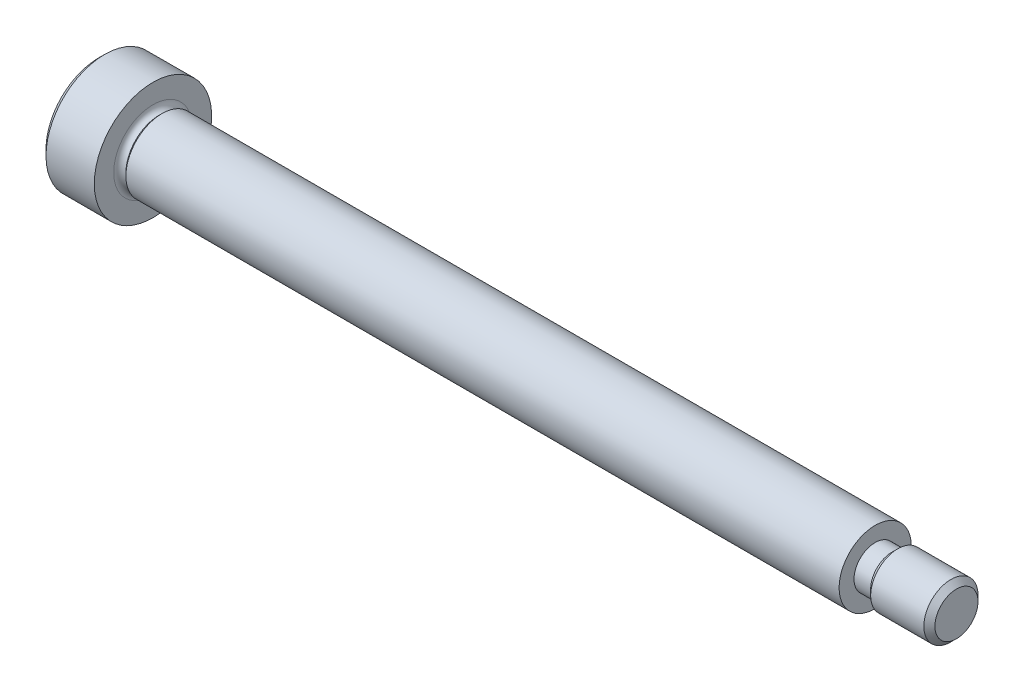
ISO-10303-21;
HEADER;
FILE_DESCRIPTION(('STEP AP214'),'2;1');
FILE_NAME('part.step','',(''),(''),'','','');
FILE_SCHEMA(('AUTOMOTIVE_DESIGN { 1 0 10303 214 1 1 1 1 }'));
ENDSEC;
DATA;
#1=APPLICATION_CONTEXT('core data for automotive mechanical design processes');
#2=APPLICATION_PROTOCOL_DEFINITION('international standard','automotive_design',2000,#1);
#3=PRODUCT_CONTEXT('',#1,'mechanical');
#4=PRODUCT('Part','Part','',(#3));
#5=PRODUCT_RELATED_PRODUCT_CATEGORY('part','',(#4));
#6=PRODUCT_DEFINITION_FORMATION('','',#4);
#7=PRODUCT_DEFINITION_CONTEXT('part definition',#1,'design');
#8=PRODUCT_DEFINITION('design','',#6,#7);
#9=PRODUCT_DEFINITION_SHAPE('','',#8);
#10=(LENGTH_UNIT() NAMED_UNIT(*) SI_UNIT(.MILLI.,.METRE.));
#11=(NAMED_UNIT(*) PLANE_ANGLE_UNIT() SI_UNIT($,.RADIAN.));
#12=(NAMED_UNIT(*) SI_UNIT($,.STERADIAN.) SOLID_ANGLE_UNIT());
#13=UNCERTAINTY_MEASURE_WITH_UNIT(LENGTH_MEASURE(1.E-05),#10,'distance_accuracy_value','');
#14=(GEOMETRIC_REPRESENTATION_CONTEXT(3) GLOBAL_UNCERTAINTY_ASSIGNED_CONTEXT((#13)) GLOBAL_UNIT_ASSIGNED_CONTEXT((#10,
#11,#12)) REPRESENTATION_CONTEXT('',''));
#15=CARTESIAN_POINT('',(0.,0.,0.));
#16=DIRECTION('',(0.,0.,1.));
#17=DIRECTION('',(1.,0.,0.));
#18=AXIS2_PLACEMENT_3D('',#15,#16,#17);
#19=CARTESIAN_POINT('',(-6.,-6.00984515230403,5.85));
#20=DIRECTION('',(-1.,0.,0.));
#21=DIRECTION('',(0.,1.,0.));
#22=AXIS2_PLACEMENT_3D('',#19,#20,#21);
#23=PLANE('',#22);
#24=CARTESIAN_POINT('',(-6.,0.,0.));
#25=DIRECTION('',(-1.,0.,0.));
#26=DIRECTION('',(0.,0.,-1.));
#27=AXIS2_PLACEMENT_3D('',#24,#25,#26);
#28=CIRCLE('',#27,5.85);
#29=CARTESIAN_POINT('',(-6.,0.,-5.85));
#30=VERTEX_POINT('',#29);
#31=EDGE_CURVE('E111',#30,#30,#28,.F.);
#32=ORIENTED_EDGE('',*,*,#31,.F.);
#33=EDGE_LOOP('',(#32));
#34=FACE_BOUND('',#33,.T.);
#35=DIRECTION('',(0.,0.499999999999983,-0.866025403784448));
#36=VECTOR('',#35,1.);
#37=CARTESIAN_POINT('',(-6.,-2.8867513459481,0.));
#38=LINE('',#37,#36);
#39=CARTESIAN_POINT('',(-6.,-1.4433756729741,-2.5));
#40=VERTEX_POINT('',#39);
#41=CARTESIAN_POINT('',(-6.,-2.8867513459481,0.));
#42=VERTEX_POINT('',#41);
#43=EDGE_CURVE('E98',#40,#42,#38,.F.);
#44=ORIENTED_EDGE('',*,*,#43,.F.);
#45=DIRECTION('',(0.,1.,0.));
#46=VECTOR('',#45,1.);
#47=CARTESIAN_POINT('',(-6.,-1.4433756729741,-2.5));
#48=LINE('',#47,#46);
#49=CARTESIAN_POINT('',(-6.,1.4433756729741,-2.5));
#50=VERTEX_POINT('',#49);
#51=EDGE_CURVE('E87',#50,#40,#48,.F.);
#52=ORIENTED_EDGE('',*,*,#51,.F.);
#53=DIRECTION('',(0.,0.499999999999983,0.866025403784449));
#54=VECTOR('',#53,1.);
#55=CARTESIAN_POINT('',(-6.,1.4433756729741,-2.5));
#56=LINE('',#55,#54);
#57=CARTESIAN_POINT('',(-6.,2.8867513459481,0.));
#58=VERTEX_POINT('',#57);
#59=EDGE_CURVE('E97',#58,#50,#56,.F.);
#60=ORIENTED_EDGE('',*,*,#59,.F.);
#61=DIRECTION('',(0.,-0.499999999999982,0.866025403784449));
#62=VECTOR('',#61,1.);
#63=CARTESIAN_POINT('',(-6.,2.8867513459481,0.));
#64=LINE('',#63,#62);
#65=CARTESIAN_POINT('',(-6.,1.4433756729741,2.5));
#66=VERTEX_POINT('',#65);
#67=EDGE_CURVE('E121',#66,#58,#64,.F.);
#68=ORIENTED_EDGE('',*,*,#67,.F.);
#69=DIRECTION('',(0.,-1.,0.));
#70=VECTOR('',#69,1.);
#71=CARTESIAN_POINT('',(-6.,1.4433756729741,2.5));
#72=LINE('',#71,#70);
#73=CARTESIAN_POINT('',(-6.,-1.4433756729741,2.5));
#74=VERTEX_POINT('',#73);
#75=EDGE_CURVE('E125',#74,#66,#72,.F.);
#76=ORIENTED_EDGE('',*,*,#75,.F.);
#77=DIRECTION('',(0.,-0.499999999999983,-0.866025403784448));
#78=VECTOR('',#77,1.);
#79=CARTESIAN_POINT('',(-6.,-1.4433756729741,2.5));
#80=LINE('',#79,#78);
#81=EDGE_CURVE('E110',#42,#74,#80,.F.);
#82=ORIENTED_EDGE('',*,*,#81,.F.);
#83=EDGE_LOOP('',(#44,#52,#60,#68,#76,#82));
#84=FACE_BOUND('',#83,.T.);
#85=ADVANCED_FACE('F17',(#34,#84),#23,.T.);
#86=CARTESIAN_POINT('',(0.,-6.67760572478225,-6.5));
#87=DIRECTION('',(1.,0.,0.));
#88=DIRECTION('',(0.,1.,0.));
#89=AXIS2_PLACEMENT_3D('',#86,#87,#88);
#90=PLANE('',#89);
#91=CARTESIAN_POINT('',(0.,0.,0.));
#92=DIRECTION('',(1.,0.,0.));
#93=DIRECTION('',(0.,0.,1.));
#94=AXIS2_PLACEMENT_3D('',#91,#92,#93);
#95=CIRCLE('',#94,6.5);
#96=CARTESIAN_POINT('',(0.,0.,6.5));
#97=VERTEX_POINT('',#96);
#98=EDGE_CURVE('E133',#97,#97,#95,.T.);
#99=ORIENTED_EDGE('',*,*,#98,.T.);
#100=EDGE_LOOP('',(#99));
#101=FACE_BOUND('',#100,.T.);
#102=CARTESIAN_POINT('',(0.,0.,0.));
#103=DIRECTION('',(-1.,0.,0.));
#104=DIRECTION('',(0.,0.,-1.));
#105=AXIS2_PLACEMENT_3D('',#102,#103,#104);
#106=CIRCLE('',#105,4.35000000000001);
#107=CARTESIAN_POINT('',(0.,0.,-4.35000000000001));
#108=VERTEX_POINT('',#107);
#109=EDGE_CURVE('E138',#108,#108,#106,.F.);
#110=ORIENTED_EDGE('',*,*,#109,.F.);
#111=EDGE_LOOP('',(#110));
#112=FACE_BOUND('',#111,.T.);
#113=ADVANCED_FACE('F284',(#101,#112),#90,.T.);
#114=CARTESIAN_POINT('',(80.,-4.,-4.));
#115=DIRECTION('',(1.,0.,0.));
#116=DIRECTION('',(0.,1.,0.));
#117=AXIS2_PLACEMENT_3D('',#114,#115,#116);
#118=PLANE('',#117);
#119=CARTESIAN_POINT('',(80.,0.,0.));
#120=DIRECTION('',(1.,0.,0.));
#121=DIRECTION('',(0.,0.,1.));
#122=AXIS2_PLACEMENT_3D('',#119,#120,#121);
#123=CIRCLE('',#122,4.);
#124=CARTESIAN_POINT('',(80.,0.,4.));
#125=VERTEX_POINT('',#124);
#126=EDGE_CURVE('E141',#125,#125,#123,.T.);
#127=ORIENTED_EDGE('',*,*,#126,.T.);
#128=EDGE_LOOP('',(#127));
#129=FACE_BOUND('',#128,.T.);
#130=CARTESIAN_POINT('',(80.,0.,0.));
#131=DIRECTION('',(-1.,0.,0.));
#132=DIRECTION('',(0.,0.,-1.));
#133=AXIS2_PLACEMENT_3D('',#130,#131,#132);
#134=CIRCLE('',#133,2.35);
#135=CARTESIAN_POINT('',(80.,0.,-2.35));
#136=VERTEX_POINT('',#135);
#137=EDGE_CURVE('E144',#136,#136,#134,.F.);
#138=ORIENTED_EDGE('',*,*,#137,.F.);
#139=EDGE_LOOP('',(#138));
#140=FACE_BOUND('',#139,.T.);
#141=ADVANCED_FACE('F281',(#129,#140),#118,.T.);
#142=CARTESIAN_POINT('',(89.,-2.3865,-2.3865));
#143=DIRECTION('',(1.,0.,0.));
#144=DIRECTION('',(0.,1.,0.));
#145=AXIS2_PLACEMENT_3D('',#142,#143,#144);
#146=PLANE('',#145);
#147=CARTESIAN_POINT('',(89.,0.,0.));
#148=DIRECTION('',(1.,0.,0.));
#149=DIRECTION('',(0.,0.,1.));
#150=AXIS2_PLACEMENT_3D('',#147,#148,#149);
#151=CIRCLE('',#150,2.3865);
#152=CARTESIAN_POINT('',(89.,0.,2.3865));
#153=VERTEX_POINT('',#152);
#154=EDGE_CURVE('E147',#153,#153,#151,.T.);
#155=ORIENTED_EDGE('',*,*,#154,.T.);
#156=EDGE_LOOP('',(#155));
#157=FACE_BOUND('',#156,.T.);
#158=ADVANCED_FACE('F283',(#157),#146,.T.);
#159=CARTESIAN_POINT('',(-3.,-2.16506350946112,-1.24999999999996));
#160=DIRECTION('',(-1.,0.,0.));
#161=DIRECTION('',(0.,1.,0.));
#162=AXIS2_PLACEMENT_3D('',#159,#160,#161);
#163=PLANE('',#162);
#164=DIRECTION('',(0.,-1.,0.));
#165=VECTOR('',#164,1.);
#166=CARTESIAN_POINT('',(-3.,0.,-2.5));
#167=LINE('',#166,#165);
#168=CARTESIAN_POINT('',(-3.,-1.4433756729741,-2.5));
#169=VERTEX_POINT('',#168);
#170=CARTESIAN_POINT('',(-3.,0.,-2.5));
#171=VERTEX_POINT('',#170);
#172=EDGE_CURVE('E150',#169,#171,#167,.F.);
#173=ORIENTED_EDGE('',*,*,#172,.F.);
#174=DIRECTION('',(0.,-0.499999999999983,0.866025403784448));
#175=VECTOR('',#174,1.);
#176=CARTESIAN_POINT('',(-3.,-1.4433756729741,-2.5));
#177=LINE('',#176,#175);
#178=CARTESIAN_POINT('',(-3.,-2.16506350946112,-1.24999999999996));
#179=VERTEX_POINT('',#178);
#180=EDGE_CURVE('E105',#179,#169,#177,.F.);
#181=ORIENTED_EDGE('',*,*,#180,.F.);
#182=CARTESIAN_POINT('',(-3.,0.,0.));
#183=DIRECTION('',(1.,0.,0.));
#184=DIRECTION('',(0.,-0.866025403784448,-0.499999999999983));
#185=AXIS2_PLACEMENT_3D('',#182,#183,#184);
#186=CIRCLE('',#185,2.5);
#187=EDGE_CURVE('E155',#179,#171,#186,.T.);
#188=ORIENTED_EDGE('',*,*,#187,.T.);
#189=EDGE_LOOP('',(#173,#181,#188));
#190=FACE_BOUND('',#189,.T.);
#191=ADVANCED_FACE('F292',(#190),#163,.T.);
#192=CARTESIAN_POINT('',(-3.,-2.8867513459481,1.24999999999996));
#193=DIRECTION('',(-1.,0.,0.));
#194=DIRECTION('',(0.,1.,0.));
#195=AXIS2_PLACEMENT_3D('',#192,#193,#194);
#196=PLANE('',#195);
#197=DIRECTION('',(0.,-0.499999999999983,0.866025403784448));
#198=VECTOR('',#197,1.);
#199=CARTESIAN_POINT('',(-3.,-2.16506350946112,-1.24999999999996));
#200=LINE('',#199,#198);
#201=CARTESIAN_POINT('',(-3.,-2.8867513459481,0.));
#202=VERTEX_POINT('',#201);
#203=EDGE_CURVE('E160',#202,#179,#200,.F.);
#204=ORIENTED_EDGE('',*,*,#203,.F.);
#205=DIRECTION('',(0.,0.499999999999983,0.866025403784448));
#206=VECTOR('',#205,1.);
#207=CARTESIAN_POINT('',(-3.,-2.8867513459481,0.));
#208=LINE('',#207,#206);
#209=CARTESIAN_POINT('',(-3.,-2.16506350946112,1.24999999999996));
#210=VERTEX_POINT('',#209);
#211=EDGE_CURVE('E164',#210,#202,#208,.F.);
#212=ORIENTED_EDGE('',*,*,#211,.F.);
#213=CARTESIAN_POINT('',(-3.,0.,0.));
#214=DIRECTION('',(1.,0.,0.));
#215=DIRECTION('',(0.,-0.866025403784448,0.499999999999983));
#216=AXIS2_PLACEMENT_3D('',#213,#214,#215);
#217=CIRCLE('',#216,2.5);
#218=EDGE_CURVE('E169',#210,#179,#217,.T.);
#219=ORIENTED_EDGE('',*,*,#218,.T.);
#220=EDGE_LOOP('',(#204,#212,#219));
#221=FACE_BOUND('',#220,.T.);
#222=ADVANCED_FACE('F355',(#221),#196,.T.);
#223=CARTESIAN_POINT('',(-3.,-2.16506350946112,2.5));
#224=DIRECTION('',(-1.,0.,0.));
#225=DIRECTION('',(0.,1.,0.));
#226=AXIS2_PLACEMENT_3D('',#223,#224,#225);
#227=PLANE('',#226);
#228=DIRECTION('',(0.,0.499999999999983,0.866025403784448));
#229=VECTOR('',#228,1.);
#230=CARTESIAN_POINT('',(-3.,-2.16506350946112,1.24999999999996));
#231=LINE('',#230,#229);
#232=CARTESIAN_POINT('',(-3.,-1.4433756729741,2.5));
#233=VERTEX_POINT('',#232);
#234=EDGE_CURVE('E174',#233,#210,#231,.F.);
#235=ORIENTED_EDGE('',*,*,#234,.F.);
#236=DIRECTION('',(0.,1.,0.));
#237=VECTOR('',#236,1.);
#238=CARTESIAN_POINT('',(-3.,-1.4433756729741,2.5));
#239=LINE('',#238,#237);
#240=CARTESIAN_POINT('',(-3.,0.,2.5));
#241=VERTEX_POINT('',#240);
#242=EDGE_CURVE('E178',#241,#233,#239,.F.);
#243=ORIENTED_EDGE('',*,*,#242,.F.);
#244=CARTESIAN_POINT('',(-3.,0.,0.));
#245=DIRECTION('',(1.,0.,0.));
#246=DIRECTION('',(0.,0.,1.));
#247=AXIS2_PLACEMENT_3D('',#244,#245,#246);
#248=CIRCLE('',#247,2.5);
#249=EDGE_CURVE('E183',#241,#210,#248,.T.);
#250=ORIENTED_EDGE('',*,*,#249,.T.);
#251=EDGE_LOOP('',(#235,#243,#250));
#252=FACE_BOUND('',#251,.T.);
#253=ADVANCED_FACE('F361',(#252),#227,.T.);
#254=CARTESIAN_POINT('',(-3.,0.,2.5));
#255=DIRECTION('',(-1.,0.,0.));
#256=DIRECTION('',(0.,1.,0.));
#257=AXIS2_PLACEMENT_3D('',#254,#255,#256);
#258=PLANE('',#257);
#259=DIRECTION('',(0.,1.,0.));
#260=VECTOR('',#259,1.);
#261=CARTESIAN_POINT('',(-3.,0.,2.5));
#262=LINE('',#261,#260);
#263=CARTESIAN_POINT('',(-3.,1.4433756729741,2.5));
#264=VERTEX_POINT('',#263);
#265=EDGE_CURVE('E188',#264,#241,#262,.F.);
#266=ORIENTED_EDGE('',*,*,#265,.F.);
#267=DIRECTION('',(0.,0.499999999999982,-0.866025403784449));
#268=VECTOR('',#267,1.);
#269=CARTESIAN_POINT('',(-3.,1.4433756729741,2.5));
#270=LINE('',#269,#268);
#271=CARTESIAN_POINT('',(-3.,2.16506350946112,1.24999999999996));
#272=VERTEX_POINT('',#271);
#273=EDGE_CURVE('E192',#272,#264,#270,.F.);
#274=ORIENTED_EDGE('',*,*,#273,.F.);
#275=CARTESIAN_POINT('',(-3.,0.,0.));
#276=DIRECTION('',(1.,0.,0.));
#277=DIRECTION('',(0.,0.866025403784448,0.499999999999983));
#278=AXIS2_PLACEMENT_3D('',#275,#276,#277);
#279=CIRCLE('',#278,2.5);
#280=EDGE_CURVE('E196',#272,#241,#279,.T.);
#281=ORIENTED_EDGE('',*,*,#280,.T.);
#282=EDGE_LOOP('',(#266,#274,#281));
#283=FACE_BOUND('',#282,.T.);
#284=ADVANCED_FACE('F368',(#283),#258,.T.);
#285=CARTESIAN_POINT('',(-3.,2.16506350946112,1.24999999999996));
#286=DIRECTION('',(-1.,0.,0.));
#287=DIRECTION('',(0.,1.,0.));
#288=AXIS2_PLACEMENT_3D('',#285,#286,#287);
#289=PLANE('',#288);
#290=DIRECTION('',(0.,0.499999999999985,-0.866025403784448));
#291=VECTOR('',#290,1.);
#292=CARTESIAN_POINT('',(-3.,2.16506350946112,1.24999999999996));
#293=LINE('',#292,#291);
#294=CARTESIAN_POINT('',(-3.,2.8867513459481,0.));
#295=VERTEX_POINT('',#294);
#296=EDGE_CURVE('E201',#295,#272,#293,.F.);
#297=ORIENTED_EDGE('',*,*,#296,.F.);
#298=DIRECTION('',(0.,-0.499999999999984,-0.866025403784448));
#299=VECTOR('',#298,1.);
#300=CARTESIAN_POINT('',(-3.,2.8867513459481,0.));
#301=LINE('',#300,#299);
#302=CARTESIAN_POINT('',(-3.,2.16506350946112,-1.24999999999996));
#303=VERTEX_POINT('',#302);
#304=EDGE_CURVE('E205',#303,#295,#301,.F.);
#305=ORIENTED_EDGE('',*,*,#304,.F.);
#306=CARTESIAN_POINT('',(-3.,0.,0.));
#307=DIRECTION('',(1.,0.,0.));
#308=DIRECTION('',(0.,0.866025403784448,-0.499999999999983));
#309=AXIS2_PLACEMENT_3D('',#306,#307,#308);
#310=CIRCLE('',#309,2.5);
#311=EDGE_CURVE('E210',#303,#272,#310,.T.);
#312=ORIENTED_EDGE('',*,*,#311,.T.);
#313=EDGE_LOOP('',(#297,#305,#312));
#314=FACE_BOUND('',#313,.T.);
#315=ADVANCED_FACE('F373',(#314),#289,.T.);
#316=CARTESIAN_POINT('',(-3.,0.,-1.24999999999996));
#317=DIRECTION('',(-1.,0.,0.));
#318=DIRECTION('',(0.,1.,0.));
#319=AXIS2_PLACEMENT_3D('',#316,#317,#318);
#320=PLANE('',#319);
#321=DIRECTION('',(0.,-0.499999999999983,-0.866025403784449));
#322=VECTOR('',#321,1.);
#323=CARTESIAN_POINT('',(-3.,2.16506350946112,-1.24999999999996));
#324=LINE('',#323,#322);
#325=CARTESIAN_POINT('',(-3.,1.4433756729741,-2.5));
#326=VERTEX_POINT('',#325);
#327=EDGE_CURVE('E215',#326,#303,#324,.F.);
#328=ORIENTED_EDGE('',*,*,#327,.F.);
#329=DIRECTION('',(0.,-1.,0.));
#330=VECTOR('',#329,1.);
#331=CARTESIAN_POINT('',(-3.,1.4433756729741,-2.5));
#332=LINE('',#331,#330);
#333=EDGE_CURVE('E219',#171,#326,#332,.F.);
#334=ORIENTED_EDGE('',*,*,#333,.F.);
#335=CARTESIAN_POINT('',(-3.,0.,0.));
#336=DIRECTION('',(1.,0.,0.));
#337=DIRECTION('',(0.,0.,-1.));
#338=AXIS2_PLACEMENT_3D('',#335,#336,#337);
#339=CIRCLE('',#338,2.5);
#340=EDGE_CURVE('E223',#171,#303,#339,.T.);
#341=ORIENTED_EDGE('',*,*,#340,.T.);
#342=EDGE_LOOP('',(#328,#334,#341));
#343=FACE_BOUND('',#342,.T.);
#344=ADVANCED_FACE('F376',(#343),#320,.T.);
#345=CARTESIAN_POINT('',(-3.,-1.4433756729741,2.5));
#346=DIRECTION('',(0.,0.,-1.));
#347=DIRECTION('',(-1.,0.,0.));
#348=AXIS2_PLACEMENT_3D('',#345,#346,#347);
#349=PLANE('',#348);
#350=ORIENTED_EDGE('',*,*,#265,.T.);
#351=ORIENTED_EDGE('',*,*,#242,.T.);
#352=DIRECTION('',(-1.,0.,0.));
#353=VECTOR('',#352,1.);
#354=CARTESIAN_POINT('',(-3.,-1.4433756729741,2.5));
#355=LINE('',#354,#353);
#356=EDGE_CURVE('E228',#233,#74,#355,.T.);
#357=ORIENTED_EDGE('',*,*,#356,.T.);
#358=ORIENTED_EDGE('',*,*,#75,.T.);
#359=DIRECTION('',(1.,0.,0.));
#360=VECTOR('',#359,1.);
#361=CARTESIAN_POINT('',(-6.,1.4433756729741,2.5));
#362=LINE('',#361,#360);
#363=EDGE_CURVE('E233',#264,#66,#362,.F.);
#364=ORIENTED_EDGE('',*,*,#363,.F.);
#365=EDGE_LOOP('',(#350,#351,#357,#358,#364));
#366=FACE_BOUND('',#365,.T.);
#367=ADVANCED_FACE('F363',(#366),#349,.T.);
#368=CARTESIAN_POINT('',(-6.,-2.8867513459481,0.));
#369=DIRECTION('',(0.,0.866025403784449,-0.499999999999983));
#370=DIRECTION('',(0.,0.499999999999983,0.866025403784449));
#371=AXIS2_PLACEMENT_3D('',#368,#369,#370);
#372=PLANE('',#371);
#373=ORIENTED_EDGE('',*,*,#234,.T.);
#374=ORIENTED_EDGE('',*,*,#211,.T.);
#375=DIRECTION('',(-1.,0.,0.));
#376=VECTOR('',#375,1.);
#377=CARTESIAN_POINT('',(-3.,-2.8867513459481,0.));
#378=LINE('',#377,#376);
#379=EDGE_CURVE('E106',#202,#42,#378,.T.);
#380=ORIENTED_EDGE('',*,*,#379,.T.);
#381=ORIENTED_EDGE('',*,*,#81,.T.);
#382=ORIENTED_EDGE('',*,*,#356,.F.);
#383=EDGE_LOOP('',(#373,#374,#380,#381,#382));
#384=FACE_BOUND('',#383,.T.);
#385=ADVANCED_FACE('F357',(#384),#372,.T.);
#386=CARTESIAN_POINT('',(-6.,-1.4433756729741,-2.5));
#387=DIRECTION('',(0.,0.866025403784449,0.499999999999983));
#388=DIRECTION('',(0.,-0.499999999999983,0.866025403784449));
#389=AXIS2_PLACEMENT_3D('',#386,#387,#388);
#390=PLANE('',#389);
#391=ORIENTED_EDGE('',*,*,#203,.T.);
#392=ORIENTED_EDGE('',*,*,#180,.T.);
#393=DIRECTION('',(-1.,0.,0.));
#394=VECTOR('',#393,1.);
#395=CARTESIAN_POINT('',(-3.,-1.4433756729741,-2.5));
#396=LINE('',#395,#394);
#397=EDGE_CURVE('E91',#169,#40,#396,.T.);
#398=ORIENTED_EDGE('',*,*,#397,.T.);
#399=ORIENTED_EDGE('',*,*,#43,.T.);
#400=ORIENTED_EDGE('',*,*,#379,.F.);
#401=EDGE_LOOP('',(#391,#392,#398,#399,#400));
#402=FACE_BOUND('',#401,.T.);
#403=ADVANCED_FACE('F102',(#402),#390,.T.);
#404=CARTESIAN_POINT('',(-6.,-1.4433756729741,-2.5));
#405=DIRECTION('',(0.,0.,1.));
#406=DIRECTION('',(1.,0.,0.));
#407=AXIS2_PLACEMENT_3D('',#404,#405,#406);
#408=PLANE('',#407);
#409=ORIENTED_EDGE('',*,*,#172,.T.);
#410=ORIENTED_EDGE('',*,*,#333,.T.);
#411=DIRECTION('',(-1.,0.,0.));
#412=VECTOR('',#411,1.);
#413=CARTESIAN_POINT('',(-3.,1.4433756729741,-2.5));
#414=LINE('',#413,#412);
#415=EDGE_CURVE('E35',#326,#50,#414,.T.);
#416=ORIENTED_EDGE('',*,*,#415,.T.);
#417=ORIENTED_EDGE('',*,*,#51,.T.);
#418=ORIENTED_EDGE('',*,*,#397,.F.);
#419=EDGE_LOOP('',(#409,#410,#416,#417,#418));
#420=FACE_BOUND('',#419,.T.);
#421=ADVANCED_FACE('F90',(#420),#408,.T.);
#422=CARTESIAN_POINT('',(-6.,2.8867513459481,0.));
#423=DIRECTION('',(0.,-0.866025403784449,0.499999999999983));
#424=DIRECTION('',(0.,-0.499999999999983,-0.866025403784449));
#425=AXIS2_PLACEMENT_3D('',#422,#423,#424);
#426=PLANE('',#425);
#427=ORIENTED_EDGE('',*,*,#327,.T.);
#428=ORIENTED_EDGE('',*,*,#304,.T.);
#429=DIRECTION('',(-1.,0.,0.));
#430=VECTOR('',#429,1.);
#431=CARTESIAN_POINT('',(-3.,2.8867513459481,0.));
#432=LINE('',#431,#430);
#433=EDGE_CURVE('E245',#295,#58,#432,.T.);
#434=ORIENTED_EDGE('',*,*,#433,.T.);
#435=ORIENTED_EDGE('',*,*,#59,.T.);
#436=ORIENTED_EDGE('',*,*,#415,.F.);
#437=EDGE_LOOP('',(#427,#428,#434,#435,#436));
#438=FACE_BOUND('',#437,.T.);
#439=ADVANCED_FACE('F317',(#438),#426,.T.);
#440=CARTESIAN_POINT('',(-6.,1.4433756729741,2.5));
#441=DIRECTION('',(0.,-0.866025403784449,-0.499999999999983));
#442=DIRECTION('',(0.,0.499999999999983,-0.866025403784449));
#443=AXIS2_PLACEMENT_3D('',#440,#441,#442);
#444=PLANE('',#443);
#445=ORIENTED_EDGE('',*,*,#296,.T.);
#446=ORIENTED_EDGE('',*,*,#273,.T.);
#447=ORIENTED_EDGE('',*,*,#363,.T.);
#448=ORIENTED_EDGE('',*,*,#67,.T.);
#449=ORIENTED_EDGE('',*,*,#433,.F.);
#450=EDGE_LOOP('',(#445,#446,#447,#448,#449));
#451=FACE_BOUND('',#450,.T.);
#452=ADVANCED_FACE('F307',(#451),#444,.T.);
#453=CARTESIAN_POINT('',(-5.34999999999999,0.,0.));
#454=DIRECTION('',(1.,0.,0.));
#455=DIRECTION('',(0.,1.92328053823384E-10,1.));
#456=AXIS2_PLACEMENT_3D('',#453,#454,#455);
#457=CONICAL_SURFACE('',#456,6.5,0.785398163397439);
#458=CARTESIAN_POINT('',(-5.34999999999999,0.,0.));
#459=DIRECTION('',(-1.,0.,0.));
#460=DIRECTION('',(0.,0.,-1.));
#461=AXIS2_PLACEMENT_3D('',#458,#459,#460);
#462=CIRCLE('',#461,6.5);
#463=CARTESIAN_POINT('',(-5.34999999999999,0.,-6.5));
#464=VERTEX_POINT('',#463);
#465=EDGE_CURVE('E250',#464,#464,#462,.F.);
#466=ORIENTED_EDGE('',*,*,#465,.F.);
#467=EDGE_LOOP('',(#466));
#468=FACE_BOUND('',#467,.T.);
#469=ORIENTED_EDGE('',*,*,#31,.T.);
#470=EDGE_LOOP('',(#469));
#471=FACE_BOUND('',#470,.T.);
#472=ADVANCED_FACE('F304',(#468,#471),#457,.T.);
#473=CARTESIAN_POINT('',(89.,0.,0.));
#474=DIRECTION('',(1.,0.,0.));
#475=DIRECTION('',(0.,7.69311847899498E-10,1.));
#476=AXIS2_PLACEMENT_3D('',#473,#474,#475);
#477=CYLINDRICAL_SURFACE('',#476,6.5);
#478=ORIENTED_EDGE('',*,*,#98,.F.);
#479=EDGE_LOOP('',(#478));
#480=FACE_BOUND('',#479,.T.);
#481=ORIENTED_EDGE('',*,*,#465,.T.);
#482=EDGE_LOOP('',(#481));
#483=FACE_BOUND('',#482,.T.);
#484=ADVANCED_FACE('F306',(#480,#483),#477,.T.);
#485=CARTESIAN_POINT('',(0.630586880057231,0.,0.));
#486=DIRECTION('',(1.,0.,0.));
#487=DIRECTION('',(0.,0.,1.));
#488=AXIS2_PLACEMENT_3D('',#485,#486,#487);
#489=TOROIDAL_SURFACE('',#488,4.32717048621548,0.630999999999961);
#490=CARTESIAN_POINT('',(0.700000000000001,0.,0.));
#491=DIRECTION('',(-1.,0.,0.));
#492=DIRECTION('',(0.,0.,-1.));
#493=AXIS2_PLACEMENT_3D('',#490,#491,#492);
#494=CIRCLE('',#493,3.7);
#495=CARTESIAN_POINT('',(0.700000000000001,0.,-3.7));
#496=VERTEX_POINT('',#495);
#497=EDGE_CURVE('E255',#496,#496,#494,.F.);
#498=ORIENTED_EDGE('',*,*,#497,.F.);
#499=EDGE_LOOP('',(#498));
#500=FACE_BOUND('',#499,.T.);
#501=ORIENTED_EDGE('',*,*,#109,.T.);
#502=EDGE_LOOP('',(#501));
#503=FACE_BOUND('',#502,.T.);
#504=ADVANCED_FACE('F314',(#500,#503),#489,.F.);
#505=CARTESIAN_POINT('',(0.999999999999998,0.,0.));
#506=DIRECTION('',(1.,0.,0.));
#507=DIRECTION('',(0.,0.,1.));
#508=AXIS2_PLACEMENT_3D('',#505,#506,#507);
#509=CONICAL_SURFACE('',#508,4.,0.785398163397457);
#510=CARTESIAN_POINT('',(0.999999999999998,0.,0.));
#511=DIRECTION('',(-1.,0.,0.));
#512=DIRECTION('',(0.,0.,-1.));
#513=AXIS2_PLACEMENT_3D('',#510,#511,#512);
#514=CIRCLE('',#513,4.);
#515=CARTESIAN_POINT('',(0.999999999999998,0.,-4.));
#516=VERTEX_POINT('',#515);
#517=EDGE_CURVE('E258',#516,#516,#514,.F.);
#518=ORIENTED_EDGE('',*,*,#517,.F.);
#519=EDGE_LOOP('',(#518));
#520=FACE_BOUND('',#519,.T.);
#521=ORIENTED_EDGE('',*,*,#497,.T.);
#522=EDGE_LOOP('',(#521));
#523=FACE_BOUND('',#522,.T.);
#524=ADVANCED_FACE('F325',(#520,#523),#509,.T.);
#525=CARTESIAN_POINT('',(89.,0.,0.));
#526=DIRECTION('',(1.,0.,0.));
#527=DIRECTION('',(0.,0.,1.));
#528=AXIS2_PLACEMENT_3D('',#525,#526,#527);
#529=CYLINDRICAL_SURFACE('',#528,4.);
#530=ORIENTED_EDGE('',*,*,#126,.F.);
#531=EDGE_LOOP('',(#530));
#532=FACE_BOUND('',#531,.T.);
#533=ORIENTED_EDGE('',*,*,#517,.T.);
#534=EDGE_LOOP('',(#533));
#535=FACE_BOUND('',#534,.T.);
#536=ADVANCED_FACE('F277',(#532,#535),#529,.T.);
#537=CARTESIAN_POINT('',(89.,0.,0.));
#538=DIRECTION('',(1.,0.,0.));
#539=DIRECTION('',(0.,1.92347149659408E-10,1.));
#540=AXIS2_PLACEMENT_3D('',#537,#538,#539);
#541=CYLINDRICAL_SURFACE('',#540,2.35);
#542=CARTESIAN_POINT('',(81.85,0.,0.));
#543=DIRECTION('',(-1.,0.,0.));
#544=DIRECTION('',(0.,0.,-1.));
#545=AXIS2_PLACEMENT_3D('',#542,#543,#544);
#546=CIRCLE('',#545,2.35);
#547=CARTESIAN_POINT('',(81.85,0.,-2.35));
#548=VERTEX_POINT('',#547);
#549=EDGE_CURVE('E261',#548,#548,#546,.F.);
#550=ORIENTED_EDGE('',*,*,#549,.F.);
#551=EDGE_LOOP('',(#550));
#552=FACE_BOUND('',#551,.T.);
#553=ORIENTED_EDGE('',*,*,#137,.T.);
#554=EDGE_LOOP('',(#553));
#555=FACE_BOUND('',#554,.T.);
#556=ADVANCED_FACE('F271',(#552,#555),#541,.T.);
#557=CARTESIAN_POINT('',(82.5,0.,0.));
#558=DIRECTION('',(1.,0.,0.));
#559=DIRECTION('',(0.,7.69387343065172E-10,1.));
#560=AXIS2_PLACEMENT_3D('',#557,#558,#559);
#561=CONICAL_SURFACE('',#560,2.99999999999999,0.785398163397439);
#562=CARTESIAN_POINT('',(82.5,0.,0.));
#563=DIRECTION('',(-1.,0.,0.));
#564=DIRECTION('',(0.,0.,-1.));
#565=AXIS2_PLACEMENT_3D('',#562,#563,#564);
#566=CIRCLE('',#565,2.99999999999999);
#567=CARTESIAN_POINT('',(82.5,0.,-2.99999999999999));
#568=VERTEX_POINT('',#567);
#569=EDGE_CURVE('E25',#568,#568,#566,.F.);
#570=ORIENTED_EDGE('',*,*,#569,.F.);
#571=EDGE_LOOP('',(#570));
#572=FACE_BOUND('',#571,.T.);
#573=ORIENTED_EDGE('',*,*,#549,.T.);
#574=EDGE_LOOP('',(#573));
#575=FACE_BOUND('',#574,.T.);
#576=ADVANCED_FACE('F268',(#572,#575),#561,.T.);
#577=CARTESIAN_POINT('',(89.,0.,0.));
#578=DIRECTION('',(1.,0.,0.));
#579=DIRECTION('',(0.,7.69327835111053E-10,1.));
#580=AXIS2_PLACEMENT_3D('',#577,#578,#579);
#581=CYLINDRICAL_SURFACE('',#580,3.);
#582=CARTESIAN_POINT('',(88.3865,0.,0.));
#583=DIRECTION('',(-1.,0.,0.));
#584=DIRECTION('',(0.,0.,-1.));
#585=AXIS2_PLACEMENT_3D('',#582,#583,#584);
#586=CIRCLE('',#585,3.);
#587=CARTESIAN_POINT('',(88.3865,0.,-3.));
#588=VERTEX_POINT('',#587);
#589=EDGE_CURVE('E11',#588,#588,#586,.F.);
#590=ORIENTED_EDGE('',*,*,#589,.F.);
#591=EDGE_LOOP('',(#590));
#592=FACE_BOUND('',#591,.T.);
#593=ORIENTED_EDGE('',*,*,#569,.T.);
#594=EDGE_LOOP('',(#593));
#595=FACE_BOUND('',#594,.T.);
#596=ADVANCED_FACE('F266',(#592,#595),#581,.T.);
#597=CARTESIAN_POINT('',(88.3865,0.,0.));
#598=DIRECTION('',(-1.,0.,0.));
#599=DIRECTION('',(0.,0.,-1.));
#600=AXIS2_PLACEMENT_3D('',#597,#598,#599);
#601=CONICAL_SURFACE('',#600,3.,0.785398163397458);
#602=ORIENTED_EDGE('',*,*,#154,.F.);
#603=EDGE_LOOP('',(#602));
#604=FACE_BOUND('',#603,.T.);
#605=ORIENTED_EDGE('',*,*,#589,.T.);
#606=EDGE_LOOP('',(#605));
#607=FACE_BOUND('',#606,.T.);
#608=ADVANCED_FACE('F334',(#604,#607),#601,.T.);
#609=CARTESIAN_POINT('',(-3.,0.,0.));
#610=DIRECTION('',(-1.,0.,0.));
#611=DIRECTION('',(0.,0.,-1.));
#612=AXIS2_PLACEMENT_3D('',#609,#610,#611);
#613=CONICAL_SURFACE('',#612,2.5,1.04719755119659);
#614=ORIENTED_EDGE('',*,*,#187,.F.);
#615=ORIENTED_EDGE('',*,*,#218,.F.);
#616=ORIENTED_EDGE('',*,*,#249,.F.);
#617=ORIENTED_EDGE('',*,*,#280,.F.);
#618=ORIENTED_EDGE('',*,*,#311,.F.);
#619=ORIENTED_EDGE('',*,*,#340,.F.);
#620=EDGE_LOOP('',(#614,#615,#616,#617,#618,#619));
#621=FACE_BOUND('',#620,.T.);
#622=CARTESIAN_POINT('',(-1.5566243270259,0.,0.));
#623=VERTEX_POINT('',#622);
#624=VERTEX_LOOP('',#623);
#625=FACE_BOUND('',#624,.T.);
#626=ADVANCED_FACE('F19',(#621,#625),#613,.F.);
#627=CLOSED_SHELL('',(#85,#113,#141,#158,#191,#222,#253,#284,#315,#344,#367,#385,#403,#421,#439,
#452,#472,#484,#504,#524,#536,#556,#576,#596,#608,#626));
#628=MANIFOLD_SOLID_BREP('B1',#627);
#629=ADVANCED_BREP_SHAPE_REPRESENTATION('',(#18,#628),#14);
#630=SHAPE_DEFINITION_REPRESENTATION(#9,#629);
ENDSEC;
END-ISO-10303-21;
